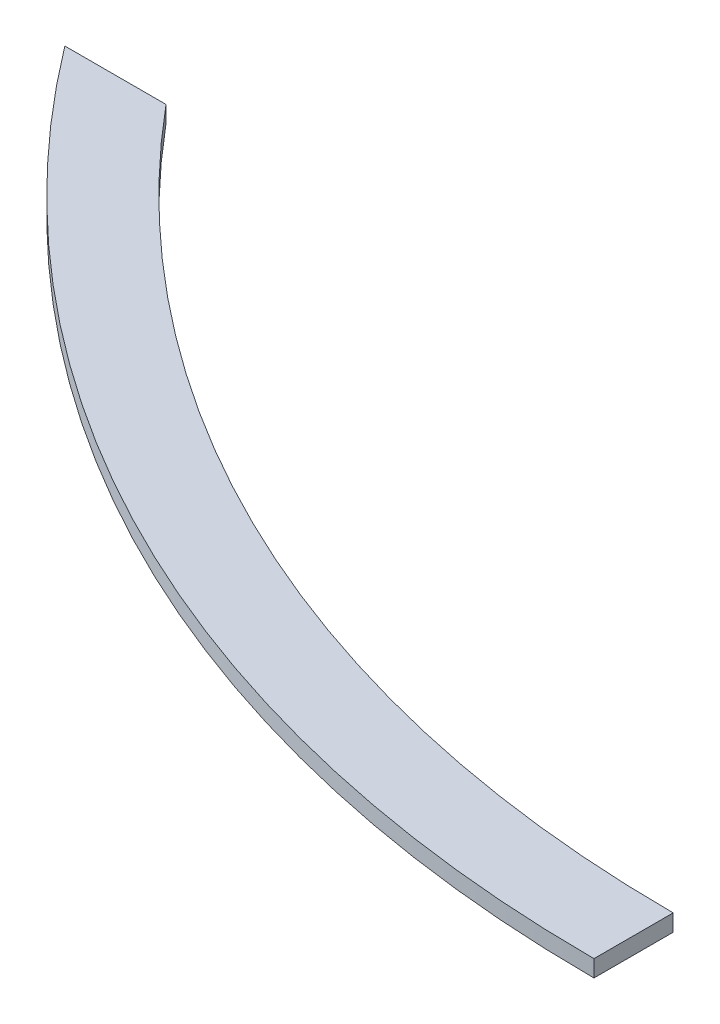
ISO-10303-21;
HEADER;
FILE_DESCRIPTION(('STEP AP214'),'2;1');
FILE_NAME('part.step','',(''),(''),'','','');
FILE_SCHEMA(('AUTOMOTIVE_DESIGN { 1 0 10303 214 1 1 1 1 }'));
ENDSEC;
DATA;
#1=APPLICATION_CONTEXT('core data for automotive mechanical design processes');
#2=APPLICATION_PROTOCOL_DEFINITION('international standard','automotive_design',2000,#1);
#3=PRODUCT_CONTEXT('',#1,'mechanical');
#4=PRODUCT('Part','Part','',(#3));
#5=PRODUCT_RELATED_PRODUCT_CATEGORY('part','',(#4));
#6=PRODUCT_DEFINITION_FORMATION('','',#4);
#7=PRODUCT_DEFINITION_CONTEXT('part definition',#1,'design');
#8=PRODUCT_DEFINITION('design','',#6,#7);
#9=PRODUCT_DEFINITION_SHAPE('','',#8);
#10=(LENGTH_UNIT() NAMED_UNIT(*) SI_UNIT(.MILLI.,.METRE.));
#11=(NAMED_UNIT(*) PLANE_ANGLE_UNIT() SI_UNIT($,.RADIAN.));
#12=(NAMED_UNIT(*) SI_UNIT($,.STERADIAN.) SOLID_ANGLE_UNIT());
#13=UNCERTAINTY_MEASURE_WITH_UNIT(LENGTH_MEASURE(1.E-05),#10,'distance_accuracy_value','');
#14=(GEOMETRIC_REPRESENTATION_CONTEXT(3) GLOBAL_UNCERTAINTY_ASSIGNED_CONTEXT((#13)) GLOBAL_UNIT_ASSIGNED_CONTEXT((#10,
#11,#12)) REPRESENTATION_CONTEXT('',''));
#15=CARTESIAN_POINT('',(0.,0.,0.));
#16=DIRECTION('',(0.,0.,1.));
#17=DIRECTION('',(1.,0.,0.));
#18=AXIS2_PLACEMENT_3D('',#15,#16,#17);
#19=CARTESIAN_POINT('',(0.,0.,301.));
#20=DIRECTION('',(0.,0.,-1.));
#21=DIRECTION('',(-1.,0.,0.));
#22=AXIS2_PLACEMENT_3D('',#19,#20,#21);
#23=PLANE('',#22);
#24=DIRECTION('',(-1.,0.,0.));
#25=VECTOR('',#24,1.);
#26=CARTESIAN_POINT('',(0.,6.35,301.));
#27=LINE('',#26,#25);
#28=CARTESIAN_POINT('',(-360.969527799785,6.35,301.));
#29=VERTEX_POINT('',#28);
#30=CARTESIAN_POINT('',(-399.248043201216,6.35,301.));
#31=VERTEX_POINT('',#30);
#32=EDGE_CURVE('E78',#29,#31,#27,.T.);
#33=ORIENTED_EDGE('',*,*,#32,.F.);
#34=DIRECTION('',(0.,-1.,0.));
#35=VECTOR('',#34,1.);
#36=CARTESIAN_POINT('',(-360.969527799785,6.35,301.));
#37=LINE('',#36,#35);
#38=CARTESIAN_POINT('',(-360.969527799785,0.,301.));
#39=VERTEX_POINT('',#38);
#40=EDGE_CURVE('E86',#39,#29,#37,.F.);
#41=ORIENTED_EDGE('',*,*,#40,.F.);
#42=DIRECTION('',(-1.,0.,0.));
#43=VECTOR('',#42,1.);
#44=CARTESIAN_POINT('',(0.,0.,301.));
#45=LINE('',#44,#43);
#46=CARTESIAN_POINT('',(-399.248043201216,0.,301.));
#47=VERTEX_POINT('',#46);
#48=EDGE_CURVE('E93',#39,#47,#45,.T.);
#49=ORIENTED_EDGE('',*,*,#48,.T.);
#50=DIRECTION('',(0.,-1.,0.));
#51=VECTOR('',#50,1.);
#52=CARTESIAN_POINT('',(-399.248043201216,6.35,301.));
#53=LINE('',#52,#51);
#54=EDGE_CURVE('E94',#47,#31,#53,.F.);
#55=ORIENTED_EDGE('',*,*,#54,.T.);
#56=EDGE_LOOP('',(#33,#41,#49,#55));
#57=FACE_BOUND('',#56,.T.);
#58=ADVANCED_FACE('F42',(#57),#23,.T.);
#59=CARTESIAN_POINT('',(0.,6.35,0.));
#60=DIRECTION('',(0.,-1.,0.));
#61=DIRECTION('',(0.,0.,-1.));
#62=AXIS2_PLACEMENT_3D('',#59,#60,#61);
#63=CYLINDRICAL_SURFACE('',#62,470.);
#64=CARTESIAN_POINT('',(0.,0.,0.));
#65=DIRECTION('',(0.,1.,0.));
#66=DIRECTION('',(0.,0.,1.));
#67=AXIS2_PLACEMENT_3D('',#64,#65,#66);
#68=CIRCLE('',#67,470.);
#69=CARTESIAN_POINT('',(0.,0.,470.));
#70=VERTEX_POINT('',#69);
#71=EDGE_CURVE('E12',#39,#70,#68,.T.);
#72=ORIENTED_EDGE('',*,*,#71,.F.);
#73=ORIENTED_EDGE('',*,*,#40,.T.);
#74=CARTESIAN_POINT('',(0.,6.35,0.));
#75=DIRECTION('',(0.,1.,0.));
#76=DIRECTION('',(0.,0.,1.));
#77=AXIS2_PLACEMENT_3D('',#74,#75,#76);
#78=CIRCLE('',#77,470.);
#79=CARTESIAN_POINT('',(0.,6.35,470.));
#80=VERTEX_POINT('',#79);
#81=EDGE_CURVE('E69',#29,#80,#78,.T.);
#82=ORIENTED_EDGE('',*,*,#81,.T.);
#83=DIRECTION('',(0.,-1.,0.));
#84=VECTOR('',#83,1.);
#85=CARTESIAN_POINT('',(0.,6.35,470.));
#86=LINE('',#85,#84);
#87=EDGE_CURVE('E87',#80,#70,#86,.T.);
#88=ORIENTED_EDGE('',*,*,#87,.T.);
#89=EDGE_LOOP('',(#72,#73,#82,#88));
#90=FACE_BOUND('',#89,.T.);
#91=ADVANCED_FACE('F85',(#90),#63,.F.);
#92=CARTESIAN_POINT('',(0.,6.35,0.));
#93=DIRECTION('',(0.,-1.,0.));
#94=DIRECTION('',(0.,0.,-1.));
#95=AXIS2_PLACEMENT_3D('',#92,#93,#94);
#96=CYLINDRICAL_SURFACE('',#95,500.);
#97=ORIENTED_EDGE('',*,*,#54,.F.);
#98=CARTESIAN_POINT('',(0.,0.,0.));
#99=DIRECTION('',(0.,1.,0.));
#100=DIRECTION('',(0.,0.,1.));
#101=AXIS2_PLACEMENT_3D('',#98,#99,#100);
#102=CIRCLE('',#101,500.);
#103=CARTESIAN_POINT('',(0.,0.,500.));
#104=VERTEX_POINT('',#103);
#105=EDGE_CURVE('E51',#47,#104,#102,.T.);
#106=ORIENTED_EDGE('',*,*,#105,.T.);
#107=DIRECTION('',(0.,-1.,0.));
#108=VECTOR('',#107,1.);
#109=CARTESIAN_POINT('',(0.,6.35,500.));
#110=LINE('',#109,#108);
#111=CARTESIAN_POINT('',(0.,6.35,500.));
#112=VERTEX_POINT('',#111);
#113=EDGE_CURVE('E110',#112,#104,#110,.T.);
#114=ORIENTED_EDGE('',*,*,#113,.F.);
#115=CARTESIAN_POINT('',(0.,6.35,0.));
#116=DIRECTION('',(0.,1.,0.));
#117=DIRECTION('',(0.,0.,1.));
#118=AXIS2_PLACEMENT_3D('',#115,#116,#117);
#119=CIRCLE('',#118,500.);
#120=EDGE_CURVE('E100',#31,#112,#119,.T.);
#121=ORIENTED_EDGE('',*,*,#120,.F.);
#122=EDGE_LOOP('',(#97,#106,#114,#121));
#123=FACE_BOUND('',#122,.T.);
#124=ADVANCED_FACE('F116',(#123),#96,.T.);
#125=CARTESIAN_POINT('',(0.,6.35,0.));
#126=DIRECTION('',(0.,1.,0.));
#127=DIRECTION('',(0.,0.,1.));
#128=AXIS2_PLACEMENT_3D('',#125,#126,#127);
#129=PLANE('',#128);
#130=ORIENTED_EDGE('',*,*,#81,.F.);
#131=ORIENTED_EDGE('',*,*,#32,.T.);
#132=ORIENTED_EDGE('',*,*,#120,.T.);
#133=DIRECTION('',(0.,0.,1.));
#134=VECTOR('',#133,1.);
#135=CARTESIAN_POINT('',(0.,6.35,0.));
#136=LINE('',#135,#134);
#137=EDGE_CURVE('E102',#80,#112,#136,.T.);
#138=ORIENTED_EDGE('',*,*,#137,.F.);
#139=EDGE_LOOP('',(#130,#131,#132,#138));
#140=FACE_BOUND('',#139,.T.);
#141=ADVANCED_FACE('F44',(#140),#129,.T.);
#142=CARTESIAN_POINT('',(0.,0.,0.));
#143=DIRECTION('',(0.,1.,0.));
#144=DIRECTION('',(0.,0.,1.));
#145=AXIS2_PLACEMENT_3D('',#142,#143,#144);
#146=PLANE('',#145);
#147=ORIENTED_EDGE('',*,*,#48,.F.);
#148=ORIENTED_EDGE('',*,*,#71,.T.);
#149=DIRECTION('',(0.,0.,1.));
#150=VECTOR('',#149,1.);
#151=CARTESIAN_POINT('',(0.,0.,0.));
#152=LINE('',#151,#150);
#153=EDGE_CURVE('E103',#70,#104,#152,.T.);
#154=ORIENTED_EDGE('',*,*,#153,.T.);
#155=ORIENTED_EDGE('',*,*,#105,.F.);
#156=EDGE_LOOP('',(#147,#148,#154,#155));
#157=FACE_BOUND('',#156,.T.);
#158=ADVANCED_FACE('F96',(#157),#146,.F.);
#159=CARTESIAN_POINT('',(0.,6.35,0.));
#160=DIRECTION('',(1.,0.,0.));
#161=DIRECTION('',(0.,0.,-1.));
#162=AXIS2_PLACEMENT_3D('',#159,#160,#161);
#163=PLANE('',#162);
#164=ORIENTED_EDGE('',*,*,#153,.F.);
#165=ORIENTED_EDGE('',*,*,#87,.F.);
#166=ORIENTED_EDGE('',*,*,#137,.T.);
#167=ORIENTED_EDGE('',*,*,#113,.T.);
#168=EDGE_LOOP('',(#164,#165,#166,#167));
#169=FACE_BOUND('',#168,.T.);
#170=ADVANCED_FACE('F113',(#169),#163,.T.);
#171=CLOSED_SHELL('',(#58,#91,#124,#141,#158,#170));
#172=MANIFOLD_SOLID_BREP('B2',#171);
#173=ADVANCED_BREP_SHAPE_REPRESENTATION('',(#18,#172),#14);
#174=SHAPE_DEFINITION_REPRESENTATION(#9,#173);
ENDSEC;
END-ISO-10303-21;
